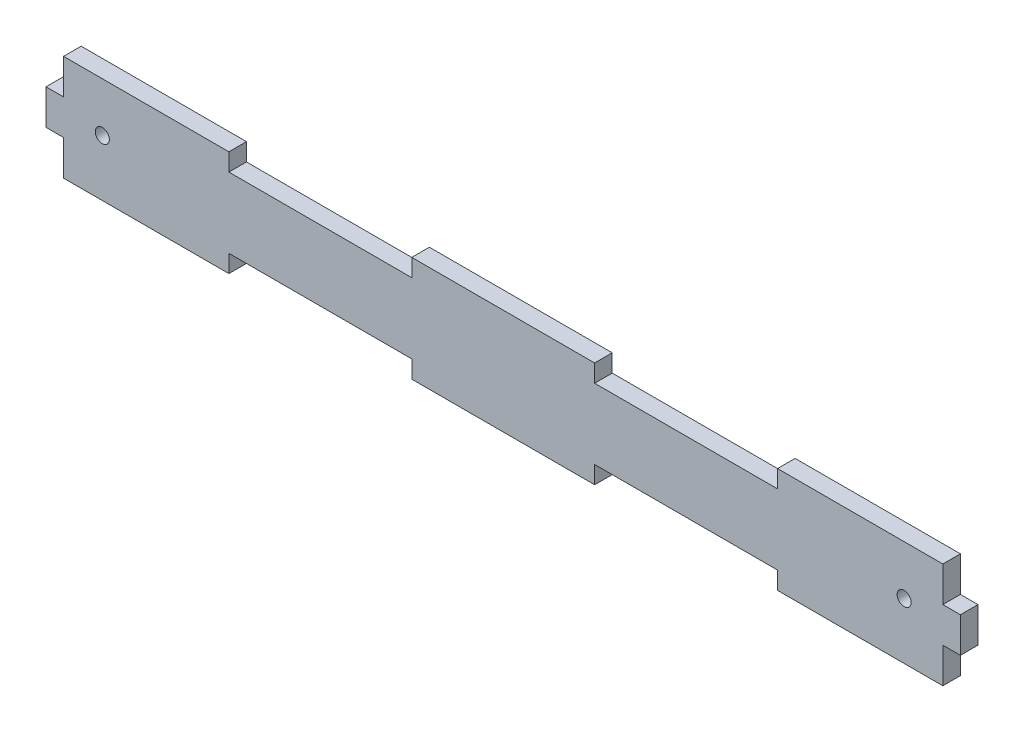
ISO-10303-21;
HEADER;
FILE_DESCRIPTION(('STEP AP214'),'2;1');
FILE_NAME('part.step','',(''),(''),'','','');
FILE_SCHEMA(('AUTOMOTIVE_DESIGN { 1 0 10303 214 1 1 1 1 }'));
ENDSEC;
DATA;
#1=APPLICATION_CONTEXT('core data for automotive mechanical design processes');
#2=APPLICATION_PROTOCOL_DEFINITION('international standard','automotive_design',2000,#1);
#3=PRODUCT_CONTEXT('',#1,'mechanical');
#4=PRODUCT('Part','Part','',(#3));
#5=PRODUCT_RELATED_PRODUCT_CATEGORY('part','',(#4));
#6=PRODUCT_DEFINITION_FORMATION('','',#4);
#7=PRODUCT_DEFINITION_CONTEXT('part definition',#1,'design');
#8=PRODUCT_DEFINITION('design','',#6,#7);
#9=PRODUCT_DEFINITION_SHAPE('','',#8);
#10=(LENGTH_UNIT() NAMED_UNIT(*) SI_UNIT(.MILLI.,.METRE.));
#11=(NAMED_UNIT(*) PLANE_ANGLE_UNIT() SI_UNIT($,.RADIAN.));
#12=(NAMED_UNIT(*) SI_UNIT($,.STERADIAN.) SOLID_ANGLE_UNIT());
#13=UNCERTAINTY_MEASURE_WITH_UNIT(LENGTH_MEASURE(1.E-05),#10,'distance_accuracy_value','');
#14=(GEOMETRIC_REPRESENTATION_CONTEXT(3) GLOBAL_UNCERTAINTY_ASSIGNED_CONTEXT((#13)) GLOBAL_UNIT_ASSIGNED_CONTEXT((#10,
#11,#12)) REPRESENTATION_CONTEXT('',''));
#15=CARTESIAN_POINT('',(0.,0.,0.));
#16=DIRECTION('',(0.,0.,1.));
#17=DIRECTION('',(1.,0.,0.));
#18=AXIS2_PLACEMENT_3D('',#15,#16,#17);
#19=CARTESIAN_POINT('',(0.,0.,5.));
#20=DIRECTION('',(0.,0.,-1.));
#21=DIRECTION('',(-1.,0.,0.));
#22=AXIS2_PLACEMENT_3D('',#19,#20,#21);
#23=PLANE('',#22);
#24=DIRECTION('',(0.,1.,0.));
#25=VECTOR('',#24,1.);
#26=CARTESIAN_POINT('',(52.,0.,5.));
#27=LINE('',#26,#25);
#28=CARTESIAN_POINT('',(52.,0.,5.));
#29=VERTEX_POINT('',#28);
#30=CARTESIAN_POINT('',(52.,5.,5.));
#31=VERTEX_POINT('',#30);
#32=EDGE_CURVE('E309',#29,#31,#27,.T.);
#33=ORIENTED_EDGE('',*,*,#32,.T.);
#34=DIRECTION('',(1.,0.,0.));
#35=VECTOR('',#34,1.);
#36=CARTESIAN_POINT('',(52.,5.,5.));
#37=LINE('',#36,#35);
#38=CARTESIAN_POINT('',(104.,5.,5.));
#39=VERTEX_POINT('',#38);
#40=EDGE_CURVE('E157',#31,#39,#37,.T.);
#41=ORIENTED_EDGE('',*,*,#40,.T.);
#42=DIRECTION('',(0.,-1.,0.));
#43=VECTOR('',#42,1.);
#44=CARTESIAN_POINT('',(104.,5.,5.));
#45=LINE('',#44,#43);
#46=CARTESIAN_POINT('',(104.,0.,5.));
#47=VERTEX_POINT('',#46);
#48=EDGE_CURVE('E384',#39,#47,#45,.T.);
#49=ORIENTED_EDGE('',*,*,#48,.T.);
#50=DIRECTION('',(1.,0.,0.));
#51=VECTOR('',#50,1.);
#52=CARTESIAN_POINT('',(104.,0.,5.));
#53=LINE('',#52,#51);
#54=CARTESIAN_POINT('',(156.,0.,5.));
#55=VERTEX_POINT('',#54);
#56=EDGE_CURVE('E403',#47,#55,#53,.T.);
#57=ORIENTED_EDGE('',*,*,#56,.T.);
#58=DIRECTION('',(0.,1.,0.));
#59=VECTOR('',#58,1.);
#60=CARTESIAN_POINT('',(156.,5.00000000000001,5.));
#61=LINE('',#60,#59);
#62=CARTESIAN_POINT('',(156.,5.00000000000001,5.));
#63=VERTEX_POINT('',#62);
#64=EDGE_CURVE('E400',#55,#63,#61,.T.);
#65=ORIENTED_EDGE('',*,*,#64,.T.);
#66=DIRECTION('',(1.,0.,0.));
#67=VECTOR('',#66,1.);
#68=CARTESIAN_POINT('',(208.,5.00000000000002,5.));
#69=LINE('',#68,#67);
#70=CARTESIAN_POINT('',(208.,5.00000000000002,5.));
#71=VERTEX_POINT('',#70);
#72=EDGE_CURVE('E402',#63,#71,#69,.T.);
#73=ORIENTED_EDGE('',*,*,#72,.T.);
#74=DIRECTION('',(0.,-1.,0.));
#75=VECTOR('',#74,1.);
#76=CARTESIAN_POINT('',(208.,0.,5.));
#77=LINE('',#76,#75);
#78=CARTESIAN_POINT('',(208.,0.,5.));
#79=VERTEX_POINT('',#78);
#80=EDGE_CURVE('E405',#71,#79,#77,.T.);
#81=ORIENTED_EDGE('',*,*,#80,.T.);
#82=DIRECTION('',(1.,0.,0.));
#83=VECTOR('',#82,1.);
#84=CARTESIAN_POINT('',(208.,0.,5.));
#85=LINE('',#84,#83);
#86=CARTESIAN_POINT('',(255.,0.,5.));
#87=VERTEX_POINT('',#86);
#88=EDGE_CURVE('E411',#79,#87,#85,.T.);
#89=ORIENTED_EDGE('',*,*,#88,.T.);
#90=DIRECTION('',(0.,1.,0.));
#91=VECTOR('',#90,1.);
#92=CARTESIAN_POINT('',(255.,10.,5.));
#93=LINE('',#92,#91);
#94=CARTESIAN_POINT('',(255.,10.,5.));
#95=VERTEX_POINT('',#94);
#96=EDGE_CURVE('E413',#87,#95,#93,.T.);
#97=ORIENTED_EDGE('',*,*,#96,.T.);
#98=DIRECTION('',(1.,0.,0.));
#99=VECTOR('',#98,1.);
#100=CARTESIAN_POINT('',(255.,10.,5.));
#101=LINE('',#100,#99);
#102=CARTESIAN_POINT('',(260.,10.,5.));
#103=VERTEX_POINT('',#102);
#104=EDGE_CURVE('E415',#95,#103,#101,.T.);
#105=ORIENTED_EDGE('',*,*,#104,.T.);
#106=DIRECTION('',(0.,1.,0.));
#107=VECTOR('',#106,1.);
#108=CARTESIAN_POINT('',(260.,10.,5.));
#109=LINE('',#108,#107);
#110=CARTESIAN_POINT('',(260.,20.,5.));
#111=VERTEX_POINT('',#110);
#112=EDGE_CURVE('E417',#103,#111,#109,.T.);
#113=ORIENTED_EDGE('',*,*,#112,.T.);
#114=DIRECTION('',(-1.,0.,0.));
#115=VECTOR('',#114,1.);
#116=CARTESIAN_POINT('',(260.,20.,5.));
#117=LINE('',#116,#115);
#118=CARTESIAN_POINT('',(255.,20.,5.));
#119=VERTEX_POINT('',#118);
#120=EDGE_CURVE('E419',#111,#119,#117,.T.);
#121=ORIENTED_EDGE('',*,*,#120,.T.);
#122=DIRECTION('',(0.,1.,0.));
#123=VECTOR('',#122,1.);
#124=CARTESIAN_POINT('',(255.,20.,5.));
#125=LINE('',#124,#123);
#126=CARTESIAN_POINT('',(255.,30.,5.));
#127=VERTEX_POINT('',#126);
#128=EDGE_CURVE('E421',#119,#127,#125,.T.);
#129=ORIENTED_EDGE('',*,*,#128,.T.);
#130=DIRECTION('',(-1.,0.,0.));
#131=VECTOR('',#130,1.);
#132=CARTESIAN_POINT('',(208.,30.,5.));
#133=LINE('',#132,#131);
#134=CARTESIAN_POINT('',(208.,30.,5.));
#135=VERTEX_POINT('',#134);
#136=EDGE_CURVE('E423',#127,#135,#133,.T.);
#137=ORIENTED_EDGE('',*,*,#136,.T.);
#138=DIRECTION('',(0.,-1.,0.));
#139=VECTOR('',#138,1.);
#140=CARTESIAN_POINT('',(208.,30.,5.));
#141=LINE('',#140,#139);
#142=CARTESIAN_POINT('',(208.,25.,5.));
#143=VERTEX_POINT('',#142);
#144=EDGE_CURVE('E425',#135,#143,#141,.T.);
#145=ORIENTED_EDGE('',*,*,#144,.T.);
#146=DIRECTION('',(-1.,0.,0.));
#147=VECTOR('',#146,1.);
#148=CARTESIAN_POINT('',(208.,25.,5.));
#149=LINE('',#148,#147);
#150=CARTESIAN_POINT('',(156.,25.,5.));
#151=VERTEX_POINT('',#150);
#152=EDGE_CURVE('E427',#143,#151,#149,.T.);
#153=ORIENTED_EDGE('',*,*,#152,.T.);
#154=DIRECTION('',(0.,1.,0.));
#155=VECTOR('',#154,1.);
#156=CARTESIAN_POINT('',(156.,25.,5.));
#157=LINE('',#156,#155);
#158=CARTESIAN_POINT('',(156.,30.,5.));
#159=VERTEX_POINT('',#158);
#160=EDGE_CURVE('E429',#151,#159,#157,.T.);
#161=ORIENTED_EDGE('',*,*,#160,.T.);
#162=DIRECTION('',(-1.,0.,0.));
#163=VECTOR('',#162,1.);
#164=CARTESIAN_POINT('',(104.,30.,5.));
#165=LINE('',#164,#163);
#166=CARTESIAN_POINT('',(104.,30.,5.));
#167=VERTEX_POINT('',#166);
#168=EDGE_CURVE('E431',#159,#167,#165,.T.);
#169=ORIENTED_EDGE('',*,*,#168,.T.);
#170=DIRECTION('',(0.,-1.,0.));
#171=VECTOR('',#170,1.);
#172=CARTESIAN_POINT('',(104.,25.,5.));
#173=LINE('',#172,#171);
#174=CARTESIAN_POINT('',(104.,25.,5.));
#175=VERTEX_POINT('',#174);
#176=EDGE_CURVE('E433',#167,#175,#173,.T.);
#177=ORIENTED_EDGE('',*,*,#176,.T.);
#178=DIRECTION('',(-1.,0.,0.));
#179=VECTOR('',#178,1.);
#180=CARTESIAN_POINT('',(52.,25.,5.));
#181=LINE('',#180,#179);
#182=CARTESIAN_POINT('',(52.,25.,5.));
#183=VERTEX_POINT('',#182);
#184=EDGE_CURVE('E435',#175,#183,#181,.T.);
#185=ORIENTED_EDGE('',*,*,#184,.T.);
#186=DIRECTION('',(0.,1.,0.));
#187=VECTOR('',#186,1.);
#188=CARTESIAN_POINT('',(52.,30.,5.));
#189=LINE('',#188,#187);
#190=CARTESIAN_POINT('',(52.,30.,5.));
#191=VERTEX_POINT('',#190);
#192=EDGE_CURVE('E437',#183,#191,#189,.T.);
#193=ORIENTED_EDGE('',*,*,#192,.T.);
#194=DIRECTION('',(-1.,0.,0.));
#195=VECTOR('',#194,1.);
#196=CARTESIAN_POINT('',(5.,30.,5.));
#197=LINE('',#196,#195);
#198=CARTESIAN_POINT('',(5.,30.,5.));
#199=VERTEX_POINT('',#198);
#200=EDGE_CURVE('E439',#191,#199,#197,.T.);
#201=ORIENTED_EDGE('',*,*,#200,.T.);
#202=DIRECTION('',(0.,-1.,0.));
#203=VECTOR('',#202,1.);
#204=CARTESIAN_POINT('',(5.,20.,5.));
#205=LINE('',#204,#203);
#206=CARTESIAN_POINT('',(5.,20.,5.));
#207=VERTEX_POINT('',#206);
#208=EDGE_CURVE('E441',#199,#207,#205,.T.);
#209=ORIENTED_EDGE('',*,*,#208,.T.);
#210=DIRECTION('',(-1.,0.,0.));
#211=VECTOR('',#210,1.);
#212=CARTESIAN_POINT('',(0.,20.,5.));
#213=LINE('',#212,#211);
#214=CARTESIAN_POINT('',(0.,20.,5.));
#215=VERTEX_POINT('',#214);
#216=EDGE_CURVE('E443',#207,#215,#213,.T.);
#217=ORIENTED_EDGE('',*,*,#216,.T.);
#218=DIRECTION('',(0.,-1.,0.));
#219=VECTOR('',#218,1.);
#220=CARTESIAN_POINT('',(0.,10.,5.));
#221=LINE('',#220,#219);
#222=CARTESIAN_POINT('',(0.,10.,5.));
#223=VERTEX_POINT('',#222);
#224=EDGE_CURVE('E236',#215,#223,#221,.T.);
#225=ORIENTED_EDGE('',*,*,#224,.T.);
#226=DIRECTION('',(1.,0.,0.));
#227=VECTOR('',#226,1.);
#228=CARTESIAN_POINT('',(5.,10.,5.));
#229=LINE('',#228,#227);
#230=CARTESIAN_POINT('',(5.,10.,5.));
#231=VERTEX_POINT('',#230);
#232=EDGE_CURVE('E230',#223,#231,#229,.T.);
#233=ORIENTED_EDGE('',*,*,#232,.T.);
#234=DIRECTION('',(0.,-1.,0.));
#235=VECTOR('',#234,1.);
#236=CARTESIAN_POINT('',(5.,10.,5.));
#237=LINE('',#236,#235);
#238=CARTESIAN_POINT('',(5.,0.,5.));
#239=VERTEX_POINT('',#238);
#240=EDGE_CURVE('E234',#231,#239,#237,.T.);
#241=ORIENTED_EDGE('',*,*,#240,.T.);
#242=DIRECTION('',(1.,0.,0.));
#243=VECTOR('',#242,1.);
#244=CARTESIAN_POINT('',(5.,0.,5.));
#245=LINE('',#244,#243);
#246=EDGE_CURVE('E54',#239,#29,#245,.T.);
#247=ORIENTED_EDGE('',*,*,#246,.T.);
#248=EDGE_LOOP('',(#33,#41,#49,#57,#65,#73,#81,#89,#97,#105,#113,#121,#129,#137,#145,#153,#161,
#169,#177,#185,#193,#201,#209,#217,#225,#233,#241,#247));
#249=FACE_BOUND('',#248,.T.);
#250=CARTESIAN_POINT('',(16.,16.,5.));
#251=DIRECTION('',(0.,0.,1.));
#252=DIRECTION('',(1.,0.,0.));
#253=AXIS2_PLACEMENT_3D('',#250,#251,#252);
#254=CIRCLE('',#253,2.);
#255=CARTESIAN_POINT('',(18.,16.,5.));
#256=VERTEX_POINT('',#255);
#257=EDGE_CURVE('E258',#256,#256,#254,.T.);
#258=ORIENTED_EDGE('',*,*,#257,.F.);
#259=EDGE_LOOP('',(#258));
#260=FACE_BOUND('',#259,.T.);
#261=CARTESIAN_POINT('',(244.,16.,5.));
#262=DIRECTION('',(0.,0.,1.));
#263=DIRECTION('',(-1.,0.,0.));
#264=AXIS2_PLACEMENT_3D('',#261,#262,#263);
#265=CIRCLE('',#264,2.);
#266=CARTESIAN_POINT('',(242.,16.,5.));
#267=VERTEX_POINT('',#266);
#268=EDGE_CURVE('E484',#267,#267,#265,.T.);
#269=ORIENTED_EDGE('',*,*,#268,.F.);
#270=EDGE_LOOP('',(#269));
#271=FACE_BOUND('',#270,.T.);
#272=ADVANCED_FACE('F37',(#249,#260,#271),#23,.F.);
#273=CARTESIAN_POINT('',(0.,0.,0.));
#274=DIRECTION('',(0.,0.,-1.));
#275=DIRECTION('',(-1.,0.,0.));
#276=AXIS2_PLACEMENT_3D('',#273,#274,#275);
#277=PLANE('',#276);
#278=CARTESIAN_POINT('',(16.,16.,0.));
#279=DIRECTION('',(0.,0.,1.));
#280=DIRECTION('',(1.,0.,0.));
#281=AXIS2_PLACEMENT_3D('',#278,#279,#280);
#282=CIRCLE('',#281,2.);
#283=CARTESIAN_POINT('',(18.,16.,0.));
#284=VERTEX_POINT('',#283);
#285=EDGE_CURVE('E489',#284,#284,#282,.T.);
#286=ORIENTED_EDGE('',*,*,#285,.T.);
#287=EDGE_LOOP('',(#286));
#288=FACE_BOUND('',#287,.T.);
#289=DIRECTION('',(0.,1.,0.));
#290=VECTOR('',#289,1.);
#291=CARTESIAN_POINT('',(52.,0.,0.));
#292=LINE('',#291,#290);
#293=CARTESIAN_POINT('',(52.,0.,0.));
#294=VERTEX_POINT('',#293);
#295=CARTESIAN_POINT('',(52.,5.,0.));
#296=VERTEX_POINT('',#295);
#297=EDGE_CURVE('E254',#294,#296,#292,.T.);
#298=ORIENTED_EDGE('',*,*,#297,.F.);
#299=DIRECTION('',(1.,0.,0.));
#300=VECTOR('',#299,1.);
#301=CARTESIAN_POINT('',(5.,0.,0.));
#302=LINE('',#301,#300);
#303=CARTESIAN_POINT('',(5.,0.,0.));
#304=VERTEX_POINT('',#303);
#305=EDGE_CURVE('E149',#304,#294,#302,.T.);
#306=ORIENTED_EDGE('',*,*,#305,.F.);
#307=DIRECTION('',(0.,-1.,0.));
#308=VECTOR('',#307,1.);
#309=CARTESIAN_POINT('',(5.,10.,0.));
#310=LINE('',#309,#308);
#311=CARTESIAN_POINT('',(5.,10.,0.));
#312=VERTEX_POINT('',#311);
#313=EDGE_CURVE('E143',#312,#304,#310,.T.);
#314=ORIENTED_EDGE('',*,*,#313,.F.);
#315=DIRECTION('',(1.,0.,0.));
#316=VECTOR('',#315,1.);
#317=CARTESIAN_POINT('',(5.,10.,0.));
#318=LINE('',#317,#316);
#319=CARTESIAN_POINT('',(0.,10.,0.));
#320=VERTEX_POINT('',#319);
#321=EDGE_CURVE('E244',#320,#312,#318,.T.);
#322=ORIENTED_EDGE('',*,*,#321,.F.);
#323=DIRECTION('',(0.,-1.,0.));
#324=VECTOR('',#323,1.);
#325=CARTESIAN_POINT('',(0.,10.,0.));
#326=LINE('',#325,#324);
#327=CARTESIAN_POINT('',(0.,20.,0.));
#328=VERTEX_POINT('',#327);
#329=EDGE_CURVE('E304',#328,#320,#326,.T.);
#330=ORIENTED_EDGE('',*,*,#329,.F.);
#331=DIRECTION('',(-1.,0.,0.));
#332=VECTOR('',#331,1.);
#333=CARTESIAN_POINT('',(0.,20.,0.));
#334=LINE('',#333,#332);
#335=CARTESIAN_POINT('',(5.,20.,0.));
#336=VERTEX_POINT('',#335);
#337=EDGE_CURVE('E302',#336,#328,#334,.T.);
#338=ORIENTED_EDGE('',*,*,#337,.F.);
#339=DIRECTION('',(0.,-1.,0.));
#340=VECTOR('',#339,1.);
#341=CARTESIAN_POINT('',(5.,20.,0.));
#342=LINE('',#341,#340);
#343=CARTESIAN_POINT('',(5.,30.,0.));
#344=VERTEX_POINT('',#343);
#345=EDGE_CURVE('E300',#344,#336,#342,.T.);
#346=ORIENTED_EDGE('',*,*,#345,.F.);
#347=DIRECTION('',(-1.,0.,0.));
#348=VECTOR('',#347,1.);
#349=CARTESIAN_POINT('',(5.,30.,0.));
#350=LINE('',#349,#348);
#351=CARTESIAN_POINT('',(52.,30.,0.));
#352=VERTEX_POINT('',#351);
#353=EDGE_CURVE('E298',#352,#344,#350,.T.);
#354=ORIENTED_EDGE('',*,*,#353,.F.);
#355=DIRECTION('',(0.,1.,0.));
#356=VECTOR('',#355,1.);
#357=CARTESIAN_POINT('',(52.,30.,0.));
#358=LINE('',#357,#356);
#359=CARTESIAN_POINT('',(52.,25.,0.));
#360=VERTEX_POINT('',#359);
#361=EDGE_CURVE('E296',#360,#352,#358,.T.);
#362=ORIENTED_EDGE('',*,*,#361,.F.);
#363=DIRECTION('',(-1.,0.,0.));
#364=VECTOR('',#363,1.);
#365=CARTESIAN_POINT('',(52.,25.,0.));
#366=LINE('',#365,#364);
#367=CARTESIAN_POINT('',(104.,25.,0.));
#368=VERTEX_POINT('',#367);
#369=EDGE_CURVE('E294',#368,#360,#366,.T.);
#370=ORIENTED_EDGE('',*,*,#369,.F.);
#371=DIRECTION('',(0.,-1.,0.));
#372=VECTOR('',#371,1.);
#373=CARTESIAN_POINT('',(104.,25.,0.));
#374=LINE('',#373,#372);
#375=CARTESIAN_POINT('',(104.,30.,0.));
#376=VERTEX_POINT('',#375);
#377=EDGE_CURVE('E292',#376,#368,#374,.T.);
#378=ORIENTED_EDGE('',*,*,#377,.F.);
#379=DIRECTION('',(-1.,0.,0.));
#380=VECTOR('',#379,1.);
#381=CARTESIAN_POINT('',(104.,30.,0.));
#382=LINE('',#381,#380);
#383=CARTESIAN_POINT('',(156.,30.,0.));
#384=VERTEX_POINT('',#383);
#385=EDGE_CURVE('E290',#384,#376,#382,.T.);
#386=ORIENTED_EDGE('',*,*,#385,.F.);
#387=DIRECTION('',(0.,1.,0.));
#388=VECTOR('',#387,1.);
#389=CARTESIAN_POINT('',(156.,25.,0.));
#390=LINE('',#389,#388);
#391=CARTESIAN_POINT('',(156.,25.,0.));
#392=VERTEX_POINT('',#391);
#393=EDGE_CURVE('E288',#392,#384,#390,.T.);
#394=ORIENTED_EDGE('',*,*,#393,.F.);
#395=DIRECTION('',(-1.,0.,0.));
#396=VECTOR('',#395,1.);
#397=CARTESIAN_POINT('',(208.,25.,0.));
#398=LINE('',#397,#396);
#399=CARTESIAN_POINT('',(208.,25.,0.));
#400=VERTEX_POINT('',#399);
#401=EDGE_CURVE('E286',#400,#392,#398,.T.);
#402=ORIENTED_EDGE('',*,*,#401,.F.);
#403=DIRECTION('',(0.,-1.,0.));
#404=VECTOR('',#403,1.);
#405=CARTESIAN_POINT('',(208.,30.,0.));
#406=LINE('',#405,#404);
#407=CARTESIAN_POINT('',(208.,30.,0.));
#408=VERTEX_POINT('',#407);
#409=EDGE_CURVE('E284',#408,#400,#406,.T.);
#410=ORIENTED_EDGE('',*,*,#409,.F.);
#411=DIRECTION('',(-1.,0.,0.));
#412=VECTOR('',#411,1.);
#413=CARTESIAN_POINT('',(208.,30.,0.));
#414=LINE('',#413,#412);
#415=CARTESIAN_POINT('',(255.,30.,0.));
#416=VERTEX_POINT('',#415);
#417=EDGE_CURVE('E282',#416,#408,#414,.T.);
#418=ORIENTED_EDGE('',*,*,#417,.F.);
#419=DIRECTION('',(0.,1.,0.));
#420=VECTOR('',#419,1.);
#421=CARTESIAN_POINT('',(255.,20.,0.));
#422=LINE('',#421,#420);
#423=CARTESIAN_POINT('',(255.,20.,0.));
#424=VERTEX_POINT('',#423);
#425=EDGE_CURVE('E280',#424,#416,#422,.T.);
#426=ORIENTED_EDGE('',*,*,#425,.F.);
#427=DIRECTION('',(-1.,0.,0.));
#428=VECTOR('',#427,1.);
#429=CARTESIAN_POINT('',(260.,20.,0.));
#430=LINE('',#429,#428);
#431=CARTESIAN_POINT('',(260.,20.,0.));
#432=VERTEX_POINT('',#431);
#433=EDGE_CURVE('E278',#432,#424,#430,.T.);
#434=ORIENTED_EDGE('',*,*,#433,.F.);
#435=DIRECTION('',(0.,1.,0.));
#436=VECTOR('',#435,1.);
#437=CARTESIAN_POINT('',(260.,10.,0.));
#438=LINE('',#437,#436);
#439=CARTESIAN_POINT('',(260.,10.,0.));
#440=VERTEX_POINT('',#439);
#441=EDGE_CURVE('E276',#440,#432,#438,.T.);
#442=ORIENTED_EDGE('',*,*,#441,.F.);
#443=DIRECTION('',(1.,0.,0.));
#444=VECTOR('',#443,1.);
#445=CARTESIAN_POINT('',(255.,10.,0.));
#446=LINE('',#445,#444);
#447=CARTESIAN_POINT('',(255.,10.,0.));
#448=VERTEX_POINT('',#447);
#449=EDGE_CURVE('E274',#448,#440,#446,.T.);
#450=ORIENTED_EDGE('',*,*,#449,.F.);
#451=DIRECTION('',(0.,1.,0.));
#452=VECTOR('',#451,1.);
#453=CARTESIAN_POINT('',(255.,10.,0.));
#454=LINE('',#453,#452);
#455=CARTESIAN_POINT('',(255.,0.,0.));
#456=VERTEX_POINT('',#455);
#457=EDGE_CURVE('E272',#456,#448,#454,.T.);
#458=ORIENTED_EDGE('',*,*,#457,.F.);
#459=DIRECTION('',(1.,0.,0.));
#460=VECTOR('',#459,1.);
#461=CARTESIAN_POINT('',(208.,0.,0.));
#462=LINE('',#461,#460);
#463=CARTESIAN_POINT('',(208.,0.,0.));
#464=VERTEX_POINT('',#463);
#465=EDGE_CURVE('E270',#464,#456,#462,.T.);
#466=ORIENTED_EDGE('',*,*,#465,.F.);
#467=DIRECTION('',(0.,-1.,0.));
#468=VECTOR('',#467,1.);
#469=CARTESIAN_POINT('',(208.,0.,0.));
#470=LINE('',#469,#468);
#471=CARTESIAN_POINT('',(208.,5.00000000000002,0.));
#472=VERTEX_POINT('',#471);
#473=EDGE_CURVE('E268',#472,#464,#470,.T.);
#474=ORIENTED_EDGE('',*,*,#473,.F.);
#475=DIRECTION('',(1.,0.,0.));
#476=VECTOR('',#475,1.);
#477=CARTESIAN_POINT('',(208.,5.00000000000002,0.));
#478=LINE('',#477,#476);
#479=CARTESIAN_POINT('',(156.,5.00000000000001,0.));
#480=VERTEX_POINT('',#479);
#481=EDGE_CURVE('E266',#480,#472,#478,.T.);
#482=ORIENTED_EDGE('',*,*,#481,.F.);
#483=DIRECTION('',(0.,1.,0.));
#484=VECTOR('',#483,1.);
#485=CARTESIAN_POINT('',(156.,5.00000000000001,0.));
#486=LINE('',#485,#484);
#487=CARTESIAN_POINT('',(156.,0.,0.));
#488=VERTEX_POINT('',#487);
#489=EDGE_CURVE('E264',#488,#480,#486,.T.);
#490=ORIENTED_EDGE('',*,*,#489,.F.);
#491=DIRECTION('',(1.,0.,0.));
#492=VECTOR('',#491,1.);
#493=CARTESIAN_POINT('',(104.,0.,0.));
#494=LINE('',#493,#492);
#495=CARTESIAN_POINT('',(104.,0.,0.));
#496=VERTEX_POINT('',#495);
#497=EDGE_CURVE('E262',#496,#488,#494,.T.);
#498=ORIENTED_EDGE('',*,*,#497,.F.);
#499=DIRECTION('',(0.,-1.,0.));
#500=VECTOR('',#499,1.);
#501=CARTESIAN_POINT('',(104.,5.,0.));
#502=LINE('',#501,#500);
#503=CARTESIAN_POINT('',(104.,5.,0.));
#504=VERTEX_POINT('',#503);
#505=EDGE_CURVE('E260',#504,#496,#502,.T.);
#506=ORIENTED_EDGE('',*,*,#505,.F.);
#507=DIRECTION('',(1.,0.,0.));
#508=VECTOR('',#507,1.);
#509=CARTESIAN_POINT('',(52.,5.,0.));
#510=LINE('',#509,#508);
#511=EDGE_CURVE('E257',#296,#504,#510,.T.);
#512=ORIENTED_EDGE('',*,*,#511,.F.);
#513=EDGE_LOOP('',(#298,#306,#314,#322,#330,#338,#346,#354,#362,#370,#378,#386,#394,#402,#410,
#418,#426,#434,#442,#450,#458,#466,#474,#482,#490,#498,#506,#512));
#514=FACE_BOUND('',#513,.T.);
#515=CARTESIAN_POINT('',(244.,16.,0.));
#516=DIRECTION('',(0.,0.,1.));
#517=DIRECTION('',(-1.,0.,0.));
#518=AXIS2_PLACEMENT_3D('',#515,#516,#517);
#519=CIRCLE('',#518,2.);
#520=CARTESIAN_POINT('',(242.,16.,0.));
#521=VERTEX_POINT('',#520);
#522=EDGE_CURVE('E487',#521,#521,#519,.T.);
#523=ORIENTED_EDGE('',*,*,#522,.T.);
#524=EDGE_LOOP('',(#523));
#525=FACE_BOUND('',#524,.T.);
#526=ADVANCED_FACE('F388',(#288,#514,#525),#277,.T.);
#527=CARTESIAN_POINT('',(52.,0.,5.));
#528=DIRECTION('',(-1.,0.,0.));
#529=DIRECTION('',(0.,0.,1.));
#530=AXIS2_PLACEMENT_3D('',#527,#528,#529);
#531=PLANE('',#530);
#532=ORIENTED_EDGE('',*,*,#297,.T.);
#533=DIRECTION('',(0.,0.,-1.));
#534=VECTOR('',#533,1.);
#535=CARTESIAN_POINT('',(52.,5.,5.));
#536=LINE('',#535,#534);
#537=EDGE_CURVE('E11',#31,#296,#536,.T.);
#538=ORIENTED_EDGE('',*,*,#537,.F.);
#539=ORIENTED_EDGE('',*,*,#32,.F.);
#540=DIRECTION('',(0.,0.,-1.));
#541=VECTOR('',#540,1.);
#542=CARTESIAN_POINT('',(52.,0.,5.));
#543=LINE('',#542,#541);
#544=EDGE_CURVE('E250',#29,#294,#543,.T.);
#545=ORIENTED_EDGE('',*,*,#544,.T.);
#546=EDGE_LOOP('',(#532,#538,#539,#545));
#547=FACE_BOUND('',#546,.T.);
#548=ADVANCED_FACE('F39',(#547),#531,.F.);
#549=CARTESIAN_POINT('',(52.,5.,5.));
#550=DIRECTION('',(0.,1.,0.));
#551=DIRECTION('',(-1.,0.,0.));
#552=AXIS2_PLACEMENT_3D('',#549,#550,#551);
#553=PLANE('',#552);
#554=ORIENTED_EDGE('',*,*,#511,.T.);
#555=DIRECTION('',(0.,0.,-1.));
#556=VECTOR('',#555,1.);
#557=CARTESIAN_POINT('',(104.,5.,5.));
#558=LINE('',#557,#556);
#559=EDGE_CURVE('E46',#39,#504,#558,.T.);
#560=ORIENTED_EDGE('',*,*,#559,.F.);
#561=ORIENTED_EDGE('',*,*,#40,.F.);
#562=ORIENTED_EDGE('',*,*,#537,.T.);
#563=EDGE_LOOP('',(#554,#560,#561,#562));
#564=FACE_BOUND('',#563,.T.);
#565=ADVANCED_FACE('F744',(#564),#553,.F.);
#566=CARTESIAN_POINT('',(104.,5.,5.));
#567=DIRECTION('',(1.,0.,0.));
#568=DIRECTION('',(0.,0.,-1.));
#569=AXIS2_PLACEMENT_3D('',#566,#567,#568);
#570=PLANE('',#569);
#571=ORIENTED_EDGE('',*,*,#505,.T.);
#572=DIRECTION('',(0.,0.,-1.));
#573=VECTOR('',#572,1.);
#574=CARTESIAN_POINT('',(104.,0.,5.));
#575=LINE('',#574,#573);
#576=EDGE_CURVE('E376',#47,#496,#575,.T.);
#577=ORIENTED_EDGE('',*,*,#576,.F.);
#578=ORIENTED_EDGE('',*,*,#48,.F.);
#579=ORIENTED_EDGE('',*,*,#559,.T.);
#580=EDGE_LOOP('',(#571,#577,#578,#579));
#581=FACE_BOUND('',#580,.T.);
#582=ADVANCED_FACE('F382',(#581),#570,.F.);
#583=CARTESIAN_POINT('',(104.,0.,5.));
#584=DIRECTION('',(0.,1.,0.));
#585=DIRECTION('',(-1.,0.,0.));
#586=AXIS2_PLACEMENT_3D('',#583,#584,#585);
#587=PLANE('',#586);
#588=ORIENTED_EDGE('',*,*,#497,.T.);
#589=DIRECTION('',(0.,0.,-1.));
#590=VECTOR('',#589,1.);
#591=CARTESIAN_POINT('',(156.,0.,5.));
#592=LINE('',#591,#590);
#593=EDGE_CURVE('E373',#55,#488,#592,.T.);
#594=ORIENTED_EDGE('',*,*,#593,.F.);
#595=ORIENTED_EDGE('',*,*,#56,.F.);
#596=ORIENTED_EDGE('',*,*,#576,.T.);
#597=EDGE_LOOP('',(#588,#594,#595,#596));
#598=FACE_BOUND('',#597,.T.);
#599=ADVANCED_FACE('F394',(#598),#587,.F.);
#600=CARTESIAN_POINT('',(156.,5.00000000000001,5.));
#601=DIRECTION('',(-1.,0.,0.));
#602=DIRECTION('',(0.,0.,1.));
#603=AXIS2_PLACEMENT_3D('',#600,#601,#602);
#604=PLANE('',#603);
#605=ORIENTED_EDGE('',*,*,#489,.T.);
#606=DIRECTION('',(0.,0.,-1.));
#607=VECTOR('',#606,1.);
#608=CARTESIAN_POINT('',(156.,5.00000000000001,5.));
#609=LINE('',#608,#607);
#610=EDGE_CURVE('E370',#63,#480,#609,.T.);
#611=ORIENTED_EDGE('',*,*,#610,.F.);
#612=ORIENTED_EDGE('',*,*,#64,.F.);
#613=ORIENTED_EDGE('',*,*,#593,.T.);
#614=EDGE_LOOP('',(#605,#611,#612,#613));
#615=FACE_BOUND('',#614,.T.);
#616=ADVANCED_FACE('F398',(#615),#604,.F.);
#617=CARTESIAN_POINT('',(208.,5.00000000000002,5.));
#618=DIRECTION('',(0.,1.,0.));
#619=DIRECTION('',(-1.,0.,0.));
#620=AXIS2_PLACEMENT_3D('',#617,#618,#619);
#621=PLANE('',#620);
#622=ORIENTED_EDGE('',*,*,#481,.T.);
#623=DIRECTION('',(0.,0.,-1.));
#624=VECTOR('',#623,1.);
#625=CARTESIAN_POINT('',(208.,5.00000000000002,5.));
#626=LINE('',#625,#624);
#627=EDGE_CURVE('E367',#71,#472,#626,.T.);
#628=ORIENTED_EDGE('',*,*,#627,.F.);
#629=ORIENTED_EDGE('',*,*,#72,.F.);
#630=ORIENTED_EDGE('',*,*,#610,.T.);
#631=EDGE_LOOP('',(#622,#628,#629,#630));
#632=FACE_BOUND('',#631,.T.);
#633=ADVANCED_FACE('F709',(#632),#621,.F.);
#634=CARTESIAN_POINT('',(208.,0.,5.));
#635=DIRECTION('',(1.,0.,0.));
#636=DIRECTION('',(0.,0.,-1.));
#637=AXIS2_PLACEMENT_3D('',#634,#635,#636);
#638=PLANE('',#637);
#639=ORIENTED_EDGE('',*,*,#473,.T.);
#640=DIRECTION('',(0.,0.,-1.));
#641=VECTOR('',#640,1.);
#642=CARTESIAN_POINT('',(208.,0.,5.));
#643=LINE('',#642,#641);
#644=EDGE_CURVE('E364',#79,#464,#643,.T.);
#645=ORIENTED_EDGE('',*,*,#644,.F.);
#646=ORIENTED_EDGE('',*,*,#80,.F.);
#647=ORIENTED_EDGE('',*,*,#627,.T.);
#648=EDGE_LOOP('',(#639,#645,#646,#647));
#649=FACE_BOUND('',#648,.T.);
#650=ADVANCED_FACE('F699',(#649),#638,.F.);
#651=CARTESIAN_POINT('',(208.,0.,5.));
#652=DIRECTION('',(0.,1.,0.));
#653=DIRECTION('',(-1.,0.,0.));
#654=AXIS2_PLACEMENT_3D('',#651,#652,#653);
#655=PLANE('',#654);
#656=ORIENTED_EDGE('',*,*,#465,.T.);
#657=DIRECTION('',(0.,0.,-1.));
#658=VECTOR('',#657,1.);
#659=CARTESIAN_POINT('',(255.,0.,5.));
#660=LINE('',#659,#658);
#661=EDGE_CURVE('E361',#87,#456,#660,.T.);
#662=ORIENTED_EDGE('',*,*,#661,.F.);
#663=ORIENTED_EDGE('',*,*,#88,.F.);
#664=ORIENTED_EDGE('',*,*,#644,.T.);
#665=EDGE_LOOP('',(#656,#662,#663,#664));
#666=FACE_BOUND('',#665,.T.);
#667=ADVANCED_FACE('F689',(#666),#655,.F.);
#668=CARTESIAN_POINT('',(255.,10.,5.));
#669=DIRECTION('',(-1.,0.,0.));
#670=DIRECTION('',(0.,0.,1.));
#671=AXIS2_PLACEMENT_3D('',#668,#669,#670);
#672=PLANE('',#671);
#673=ORIENTED_EDGE('',*,*,#457,.T.);
#674=DIRECTION('',(0.,0.,-1.));
#675=VECTOR('',#674,1.);
#676=CARTESIAN_POINT('',(255.,10.,5.));
#677=LINE('',#676,#675);
#678=EDGE_CURVE('E358',#95,#448,#677,.T.);
#679=ORIENTED_EDGE('',*,*,#678,.F.);
#680=ORIENTED_EDGE('',*,*,#96,.F.);
#681=ORIENTED_EDGE('',*,*,#661,.T.);
#682=EDGE_LOOP('',(#673,#679,#680,#681));
#683=FACE_BOUND('',#682,.T.);
#684=ADVANCED_FACE('F679',(#683),#672,.F.);
#685=CARTESIAN_POINT('',(255.,10.,5.));
#686=DIRECTION('',(0.,1.,0.));
#687=DIRECTION('',(-1.,0.,0.));
#688=AXIS2_PLACEMENT_3D('',#685,#686,#687);
#689=PLANE('',#688);
#690=ORIENTED_EDGE('',*,*,#449,.T.);
#691=DIRECTION('',(0.,0.,-1.));
#692=VECTOR('',#691,1.);
#693=CARTESIAN_POINT('',(260.,10.,5.));
#694=LINE('',#693,#692);
#695=EDGE_CURVE('E355',#103,#440,#694,.T.);
#696=ORIENTED_EDGE('',*,*,#695,.F.);
#697=ORIENTED_EDGE('',*,*,#104,.F.);
#698=ORIENTED_EDGE('',*,*,#678,.T.);
#699=EDGE_LOOP('',(#690,#696,#697,#698));
#700=FACE_BOUND('',#699,.T.);
#701=ADVANCED_FACE('F669',(#700),#689,.F.);
#702=CARTESIAN_POINT('',(260.,10.,5.));
#703=DIRECTION('',(-1.,0.,0.));
#704=DIRECTION('',(0.,0.,1.));
#705=AXIS2_PLACEMENT_3D('',#702,#703,#704);
#706=PLANE('',#705);
#707=ORIENTED_EDGE('',*,*,#441,.T.);
#708=DIRECTION('',(0.,0.,-1.));
#709=VECTOR('',#708,1.);
#710=CARTESIAN_POINT('',(260.,20.,5.));
#711=LINE('',#710,#709);
#712=EDGE_CURVE('E352',#111,#432,#711,.T.);
#713=ORIENTED_EDGE('',*,*,#712,.F.);
#714=ORIENTED_EDGE('',*,*,#112,.F.);
#715=ORIENTED_EDGE('',*,*,#695,.T.);
#716=EDGE_LOOP('',(#707,#713,#714,#715));
#717=FACE_BOUND('',#716,.T.);
#718=ADVANCED_FACE('F659',(#717),#706,.F.);
#719=CARTESIAN_POINT('',(260.,20.,5.));
#720=DIRECTION('',(0.,-1.,0.));
#721=DIRECTION('',(1.,0.,0.));
#722=AXIS2_PLACEMENT_3D('',#719,#720,#721);
#723=PLANE('',#722);
#724=ORIENTED_EDGE('',*,*,#433,.T.);
#725=DIRECTION('',(0.,0.,-1.));
#726=VECTOR('',#725,1.);
#727=CARTESIAN_POINT('',(255.,20.,5.));
#728=LINE('',#727,#726);
#729=EDGE_CURVE('E349',#119,#424,#728,.T.);
#730=ORIENTED_EDGE('',*,*,#729,.F.);
#731=ORIENTED_EDGE('',*,*,#120,.F.);
#732=ORIENTED_EDGE('',*,*,#712,.T.);
#733=EDGE_LOOP('',(#724,#730,#731,#732));
#734=FACE_BOUND('',#733,.T.);
#735=ADVANCED_FACE('F649',(#734),#723,.F.);
#736=CARTESIAN_POINT('',(255.,20.,5.));
#737=DIRECTION('',(-1.,0.,0.));
#738=DIRECTION('',(0.,0.,1.));
#739=AXIS2_PLACEMENT_3D('',#736,#737,#738);
#740=PLANE('',#739);
#741=ORIENTED_EDGE('',*,*,#425,.T.);
#742=DIRECTION('',(0.,0.,-1.));
#743=VECTOR('',#742,1.);
#744=CARTESIAN_POINT('',(255.,30.,5.));
#745=LINE('',#744,#743);
#746=EDGE_CURVE('E346',#127,#416,#745,.T.);
#747=ORIENTED_EDGE('',*,*,#746,.F.);
#748=ORIENTED_EDGE('',*,*,#128,.F.);
#749=ORIENTED_EDGE('',*,*,#729,.T.);
#750=EDGE_LOOP('',(#741,#747,#748,#749));
#751=FACE_BOUND('',#750,.T.);
#752=ADVANCED_FACE('F639',(#751),#740,.F.);
#753=CARTESIAN_POINT('',(208.,30.,5.));
#754=DIRECTION('',(0.,-1.,0.));
#755=DIRECTION('',(1.,0.,0.));
#756=AXIS2_PLACEMENT_3D('',#753,#754,#755);
#757=PLANE('',#756);
#758=ORIENTED_EDGE('',*,*,#417,.T.);
#759=DIRECTION('',(0.,0.,-1.));
#760=VECTOR('',#759,1.);
#761=CARTESIAN_POINT('',(208.,30.,5.));
#762=LINE('',#761,#760);
#763=EDGE_CURVE('E343',#135,#408,#762,.T.);
#764=ORIENTED_EDGE('',*,*,#763,.F.);
#765=ORIENTED_EDGE('',*,*,#136,.F.);
#766=ORIENTED_EDGE('',*,*,#746,.T.);
#767=EDGE_LOOP('',(#758,#764,#765,#766));
#768=FACE_BOUND('',#767,.T.);
#769=ADVANCED_FACE('F629',(#768),#757,.F.);
#770=CARTESIAN_POINT('',(208.,30.,5.));
#771=DIRECTION('',(1.,0.,0.));
#772=DIRECTION('',(0.,0.,-1.));
#773=AXIS2_PLACEMENT_3D('',#770,#771,#772);
#774=PLANE('',#773);
#775=ORIENTED_EDGE('',*,*,#409,.T.);
#776=DIRECTION('',(0.,0.,-1.));
#777=VECTOR('',#776,1.);
#778=CARTESIAN_POINT('',(208.,25.,5.));
#779=LINE('',#778,#777);
#780=EDGE_CURVE('E340',#143,#400,#779,.T.);
#781=ORIENTED_EDGE('',*,*,#780,.F.);
#782=ORIENTED_EDGE('',*,*,#144,.F.);
#783=ORIENTED_EDGE('',*,*,#763,.T.);
#784=EDGE_LOOP('',(#775,#781,#782,#783));
#785=FACE_BOUND('',#784,.T.);
#786=ADVANCED_FACE('F619',(#785),#774,.F.);
#787=CARTESIAN_POINT('',(208.,25.,5.));
#788=DIRECTION('',(0.,-1.,0.));
#789=DIRECTION('',(1.,0.,0.));
#790=AXIS2_PLACEMENT_3D('',#787,#788,#789);
#791=PLANE('',#790);
#792=ORIENTED_EDGE('',*,*,#401,.T.);
#793=DIRECTION('',(0.,0.,-1.));
#794=VECTOR('',#793,1.);
#795=CARTESIAN_POINT('',(156.,25.,5.));
#796=LINE('',#795,#794);
#797=EDGE_CURVE('E337',#151,#392,#796,.T.);
#798=ORIENTED_EDGE('',*,*,#797,.F.);
#799=ORIENTED_EDGE('',*,*,#152,.F.);
#800=ORIENTED_EDGE('',*,*,#780,.T.);
#801=EDGE_LOOP('',(#792,#798,#799,#800));
#802=FACE_BOUND('',#801,.T.);
#803=ADVANCED_FACE('F609',(#802),#791,.F.);
#804=CARTESIAN_POINT('',(156.,25.,5.));
#805=DIRECTION('',(-1.,0.,0.));
#806=DIRECTION('',(0.,0.,1.));
#807=AXIS2_PLACEMENT_3D('',#804,#805,#806);
#808=PLANE('',#807);
#809=ORIENTED_EDGE('',*,*,#393,.T.);
#810=DIRECTION('',(0.,0.,-1.));
#811=VECTOR('',#810,1.);
#812=CARTESIAN_POINT('',(156.,30.,5.));
#813=LINE('',#812,#811);
#814=EDGE_CURVE('E334',#159,#384,#813,.T.);
#815=ORIENTED_EDGE('',*,*,#814,.F.);
#816=ORIENTED_EDGE('',*,*,#160,.F.);
#817=ORIENTED_EDGE('',*,*,#797,.T.);
#818=EDGE_LOOP('',(#809,#815,#816,#817));
#819=FACE_BOUND('',#818,.T.);
#820=ADVANCED_FACE('F599',(#819),#808,.F.);
#821=CARTESIAN_POINT('',(104.,30.,5.));
#822=DIRECTION('',(0.,-1.,0.));
#823=DIRECTION('',(1.,0.,0.));
#824=AXIS2_PLACEMENT_3D('',#821,#822,#823);
#825=PLANE('',#824);
#826=ORIENTED_EDGE('',*,*,#385,.T.);
#827=DIRECTION('',(0.,0.,-1.));
#828=VECTOR('',#827,1.);
#829=CARTESIAN_POINT('',(104.,30.,5.));
#830=LINE('',#829,#828);
#831=EDGE_CURVE('E331',#167,#376,#830,.T.);
#832=ORIENTED_EDGE('',*,*,#831,.F.);
#833=ORIENTED_EDGE('',*,*,#168,.F.);
#834=ORIENTED_EDGE('',*,*,#814,.T.);
#835=EDGE_LOOP('',(#826,#832,#833,#834));
#836=FACE_BOUND('',#835,.T.);
#837=ADVANCED_FACE('F589',(#836),#825,.F.);
#838=CARTESIAN_POINT('',(104.,25.,5.));
#839=DIRECTION('',(1.,0.,0.));
#840=DIRECTION('',(0.,0.,-1.));
#841=AXIS2_PLACEMENT_3D('',#838,#839,#840);
#842=PLANE('',#841);
#843=ORIENTED_EDGE('',*,*,#377,.T.);
#844=DIRECTION('',(0.,0.,-1.));
#845=VECTOR('',#844,1.);
#846=CARTESIAN_POINT('',(104.,25.,5.));
#847=LINE('',#846,#845);
#848=EDGE_CURVE('E328',#175,#368,#847,.T.);
#849=ORIENTED_EDGE('',*,*,#848,.F.);
#850=ORIENTED_EDGE('',*,*,#176,.F.);
#851=ORIENTED_EDGE('',*,*,#831,.T.);
#852=EDGE_LOOP('',(#843,#849,#850,#851));
#853=FACE_BOUND('',#852,.T.);
#854=ADVANCED_FACE('F579',(#853),#842,.F.);
#855=CARTESIAN_POINT('',(52.,25.,5.));
#856=DIRECTION('',(0.,-1.,0.));
#857=DIRECTION('',(1.,0.,0.));
#858=AXIS2_PLACEMENT_3D('',#855,#856,#857);
#859=PLANE('',#858);
#860=ORIENTED_EDGE('',*,*,#369,.T.);
#861=DIRECTION('',(0.,0.,-1.));
#862=VECTOR('',#861,1.);
#863=CARTESIAN_POINT('',(52.,25.,5.));
#864=LINE('',#863,#862);
#865=EDGE_CURVE('E325',#183,#360,#864,.T.);
#866=ORIENTED_EDGE('',*,*,#865,.F.);
#867=ORIENTED_EDGE('',*,*,#184,.F.);
#868=ORIENTED_EDGE('',*,*,#848,.T.);
#869=EDGE_LOOP('',(#860,#866,#867,#868));
#870=FACE_BOUND('',#869,.T.);
#871=ADVANCED_FACE('F569',(#870),#859,.F.);
#872=CARTESIAN_POINT('',(52.,30.,5.));
#873=DIRECTION('',(-1.,0.,0.));
#874=DIRECTION('',(0.,0.,1.));
#875=AXIS2_PLACEMENT_3D('',#872,#873,#874);
#876=PLANE('',#875);
#877=ORIENTED_EDGE('',*,*,#361,.T.);
#878=DIRECTION('',(0.,0.,-1.));
#879=VECTOR('',#878,1.);
#880=CARTESIAN_POINT('',(52.,30.,5.));
#881=LINE('',#880,#879);
#882=EDGE_CURVE('E322',#191,#352,#881,.T.);
#883=ORIENTED_EDGE('',*,*,#882,.F.);
#884=ORIENTED_EDGE('',*,*,#192,.F.);
#885=ORIENTED_EDGE('',*,*,#865,.T.);
#886=EDGE_LOOP('',(#877,#883,#884,#885));
#887=FACE_BOUND('',#886,.T.);
#888=ADVANCED_FACE('F559',(#887),#876,.F.);
#889=CARTESIAN_POINT('',(5.,30.,5.));
#890=DIRECTION('',(0.,-1.,0.));
#891=DIRECTION('',(1.,0.,0.));
#892=AXIS2_PLACEMENT_3D('',#889,#890,#891);
#893=PLANE('',#892);
#894=ORIENTED_EDGE('',*,*,#353,.T.);
#895=DIRECTION('',(0.,0.,-1.));
#896=VECTOR('',#895,1.);
#897=CARTESIAN_POINT('',(5.,30.,5.));
#898=LINE('',#897,#896);
#899=EDGE_CURVE('E319',#199,#344,#898,.T.);
#900=ORIENTED_EDGE('',*,*,#899,.F.);
#901=ORIENTED_EDGE('',*,*,#200,.F.);
#902=ORIENTED_EDGE('',*,*,#882,.T.);
#903=EDGE_LOOP('',(#894,#900,#901,#902));
#904=FACE_BOUND('',#903,.T.);
#905=ADVANCED_FACE('F549',(#904),#893,.F.);
#906=CARTESIAN_POINT('',(5.,20.,5.));
#907=DIRECTION('',(1.,0.,0.));
#908=DIRECTION('',(0.,1.,0.));
#909=AXIS2_PLACEMENT_3D('',#906,#907,#908);
#910=PLANE('',#909);
#911=ORIENTED_EDGE('',*,*,#345,.T.);
#912=DIRECTION('',(0.,0.,-1.));
#913=VECTOR('',#912,1.);
#914=CARTESIAN_POINT('',(5.,20.,5.));
#915=LINE('',#914,#913);
#916=EDGE_CURVE('E316',#207,#336,#915,.T.);
#917=ORIENTED_EDGE('',*,*,#916,.F.);
#918=ORIENTED_EDGE('',*,*,#208,.F.);
#919=ORIENTED_EDGE('',*,*,#899,.T.);
#920=EDGE_LOOP('',(#911,#917,#918,#919));
#921=FACE_BOUND('',#920,.T.);
#922=ADVANCED_FACE('F540',(#921),#910,.F.);
#923=CARTESIAN_POINT('',(0.,20.,5.));
#924=DIRECTION('',(0.,-1.,0.));
#925=DIRECTION('',(1.,0.,0.));
#926=AXIS2_PLACEMENT_3D('',#923,#924,#925);
#927=PLANE('',#926);
#928=ORIENTED_EDGE('',*,*,#337,.T.);
#929=DIRECTION('',(0.,0.,-1.));
#930=VECTOR('',#929,1.);
#931=CARTESIAN_POINT('',(0.,20.,5.));
#932=LINE('',#931,#930);
#933=EDGE_CURVE('E313',#215,#328,#932,.T.);
#934=ORIENTED_EDGE('',*,*,#933,.F.);
#935=ORIENTED_EDGE('',*,*,#216,.F.);
#936=ORIENTED_EDGE('',*,*,#916,.T.);
#937=EDGE_LOOP('',(#928,#934,#935,#936));
#938=FACE_BOUND('',#937,.T.);
#939=ADVANCED_FACE('F449',(#938),#927,.F.);
#940=CARTESIAN_POINT('',(0.,10.,5.));
#941=DIRECTION('',(1.,0.,0.));
#942=DIRECTION('',(0.,0.,-1.));
#943=AXIS2_PLACEMENT_3D('',#940,#941,#942);
#944=PLANE('',#943);
#945=ORIENTED_EDGE('',*,*,#329,.T.);
#946=DIRECTION('',(0.,0.,-1.));
#947=VECTOR('',#946,1.);
#948=CARTESIAN_POINT('',(0.,10.,5.));
#949=LINE('',#948,#947);
#950=EDGE_CURVE('E245',#223,#320,#949,.T.);
#951=ORIENTED_EDGE('',*,*,#950,.F.);
#952=ORIENTED_EDGE('',*,*,#224,.F.);
#953=ORIENTED_EDGE('',*,*,#933,.T.);
#954=EDGE_LOOP('',(#945,#951,#952,#953));
#955=FACE_BOUND('',#954,.T.);
#956=ADVANCED_FACE('F453',(#955),#944,.F.);
#957=CARTESIAN_POINT('',(5.,10.,5.));
#958=DIRECTION('',(0.,1.,0.));
#959=DIRECTION('',(-1.,0.,0.));
#960=AXIS2_PLACEMENT_3D('',#957,#958,#959);
#961=PLANE('',#960);
#962=ORIENTED_EDGE('',*,*,#321,.T.);
#963=DIRECTION('',(0.,0.,-1.));
#964=VECTOR('',#963,1.);
#965=CARTESIAN_POINT('',(5.,10.,5.));
#966=LINE('',#965,#964);
#967=EDGE_CURVE('E241',#231,#312,#966,.T.);
#968=ORIENTED_EDGE('',*,*,#967,.F.);
#969=ORIENTED_EDGE('',*,*,#232,.F.);
#970=ORIENTED_EDGE('',*,*,#950,.T.);
#971=EDGE_LOOP('',(#962,#968,#969,#970));
#972=FACE_BOUND('',#971,.T.);
#973=ADVANCED_FACE('F242',(#972),#961,.F.);
#974=CARTESIAN_POINT('',(5.,10.,5.));
#975=DIRECTION('',(1.,0.,0.));
#976=DIRECTION('',(0.,1.,0.));
#977=AXIS2_PLACEMENT_3D('',#974,#975,#976);
#978=PLANE('',#977);
#979=ORIENTED_EDGE('',*,*,#313,.T.);
#980=DIRECTION('',(0.,0.,-1.));
#981=VECTOR('',#980,1.);
#982=CARTESIAN_POINT('',(5.,0.,5.));
#983=LINE('',#982,#981);
#984=EDGE_CURVE('E246',#239,#304,#983,.T.);
#985=ORIENTED_EDGE('',*,*,#984,.F.);
#986=ORIENTED_EDGE('',*,*,#240,.F.);
#987=ORIENTED_EDGE('',*,*,#967,.T.);
#988=EDGE_LOOP('',(#979,#985,#986,#987));
#989=FACE_BOUND('',#988,.T.);
#990=ADVANCED_FACE('F248',(#989),#978,.F.);
#991=CARTESIAN_POINT('',(5.,0.,5.));
#992=DIRECTION('',(0.,1.,0.));
#993=DIRECTION('',(0.,0.,1.));
#994=AXIS2_PLACEMENT_3D('',#991,#992,#993);
#995=PLANE('',#994);
#996=ORIENTED_EDGE('',*,*,#305,.T.);
#997=ORIENTED_EDGE('',*,*,#544,.F.);
#998=ORIENTED_EDGE('',*,*,#246,.F.);
#999=ORIENTED_EDGE('',*,*,#984,.T.);
#1000=EDGE_LOOP('',(#996,#997,#998,#999));
#1001=FACE_BOUND('',#1000,.T.);
#1002=ADVANCED_FACE('F457',(#1001),#995,.F.);
#1003=CARTESIAN_POINT('',(16.,16.,5.));
#1004=DIRECTION('',(0.,0.,-1.));
#1005=DIRECTION('',(-1.,0.,0.));
#1006=AXIS2_PLACEMENT_3D('',#1003,#1004,#1005);
#1007=CYLINDRICAL_SURFACE('',#1006,2.);
#1008=ORIENTED_EDGE('',*,*,#257,.T.);
#1009=EDGE_LOOP('',(#1008));
#1010=FACE_BOUND('',#1009,.T.);
#1011=ORIENTED_EDGE('',*,*,#285,.F.);
#1012=EDGE_LOOP('',(#1011));
#1013=FACE_BOUND('',#1012,.T.);
#1014=ADVANCED_FACE('F459',(#1010,#1013),#1007,.F.);
#1015=CARTESIAN_POINT('',(244.,16.,5.));
#1016=DIRECTION('',(0.,0.,-1.));
#1017=DIRECTION('',(-1.,0.,0.));
#1018=AXIS2_PLACEMENT_3D('',#1015,#1016,#1017);
#1019=CYLINDRICAL_SURFACE('',#1018,2.);
#1020=ORIENTED_EDGE('',*,*,#268,.T.);
#1021=EDGE_LOOP('',(#1020));
#1022=FACE_BOUND('',#1021,.T.);
#1023=ORIENTED_EDGE('',*,*,#522,.F.);
#1024=EDGE_LOOP('',(#1023));
#1025=FACE_BOUND('',#1024,.T.);
#1026=ADVANCED_FACE('F465',(#1022,#1025),#1019,.F.);
#1027=CLOSED_SHELL('',(#272,#526,#548,#565,#582,#599,#616,#633,#650,#667,#684,#701,#718,#735,
#752,#769,#786,#803,#820,#837,#854,#871,#888,#905,#922,#939,#956,#973,#990,#1002,#1014,#1026));
#1028=MANIFOLD_SOLID_BREP('B2',#1027);
#1029=ADVANCED_BREP_SHAPE_REPRESENTATION('',(#18,#1028),#14);
#1030=SHAPE_DEFINITION_REPRESENTATION(#9,#1029);
ENDSEC;
END-ISO-10303-21;
